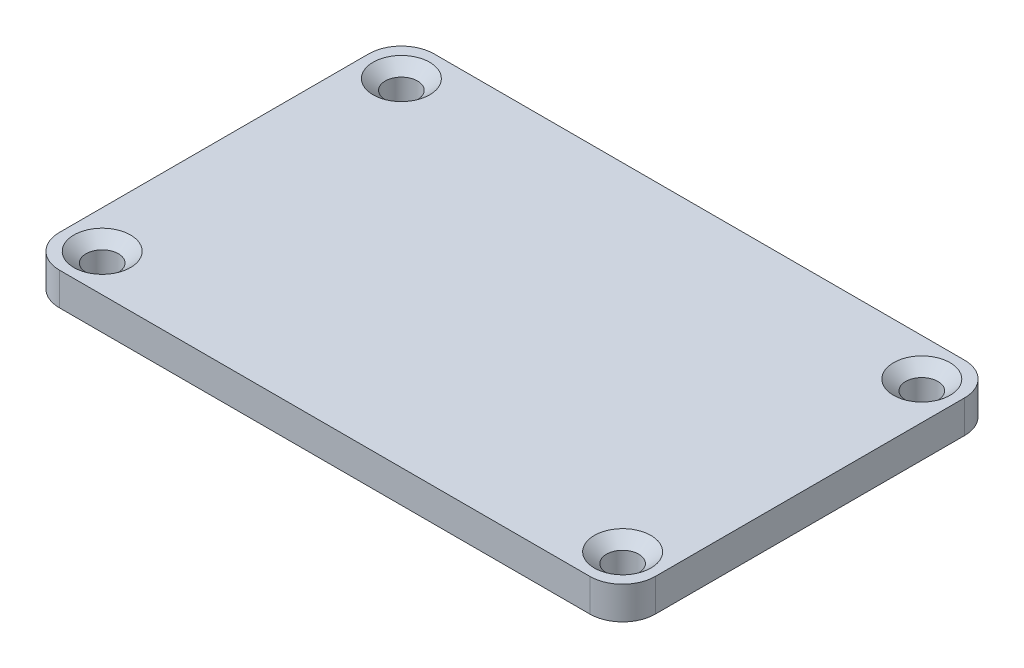
ISO-10303-21;
HEADER;
FILE_DESCRIPTION(('STEP AP214'),'2;1');
FILE_NAME('part.step','',(''),(''),'','','');
FILE_SCHEMA(('AUTOMOTIVE_DESIGN { 1 0 10303 214 1 1 1 1 }'));
ENDSEC;
DATA;
#1=APPLICATION_CONTEXT('core data for automotive mechanical design processes');
#2=APPLICATION_PROTOCOL_DEFINITION('international standard','automotive_design',2000,#1);
#3=PRODUCT_CONTEXT('',#1,'mechanical');
#4=PRODUCT('Part','Part','',(#3));
#5=PRODUCT_RELATED_PRODUCT_CATEGORY('part','',(#4));
#6=PRODUCT_DEFINITION_FORMATION('','',#4);
#7=PRODUCT_DEFINITION_CONTEXT('part definition',#1,'design');
#8=PRODUCT_DEFINITION('design','',#6,#7);
#9=PRODUCT_DEFINITION_SHAPE('','',#8);
#10=(LENGTH_UNIT() NAMED_UNIT(*) SI_UNIT(.MILLI.,.METRE.));
#11=(NAMED_UNIT(*) PLANE_ANGLE_UNIT() SI_UNIT($,.RADIAN.));
#12=(NAMED_UNIT(*) SI_UNIT($,.STERADIAN.) SOLID_ANGLE_UNIT());
#13=UNCERTAINTY_MEASURE_WITH_UNIT(LENGTH_MEASURE(1.E-05),#10,'distance_accuracy_value','');
#14=(GEOMETRIC_REPRESENTATION_CONTEXT(3) GLOBAL_UNCERTAINTY_ASSIGNED_CONTEXT((#13)) GLOBAL_UNIT_ASSIGNED_CONTEXT((#10,
#11,#12)) REPRESENTATION_CONTEXT('',''));
#15=CARTESIAN_POINT('',(0.,0.,0.));
#16=DIRECTION('',(0.,0.,1.));
#17=DIRECTION('',(1.,0.,0.));
#18=AXIS2_PLACEMENT_3D('',#15,#16,#17);
#19=CARTESIAN_POINT('',(30.099,3.302,18.923));
#20=DIRECTION('',(-1.,0.,0.));
#21=DIRECTION('',(0.,0.,1.));
#22=AXIS2_PLACEMENT_3D('',#19,#20,#21);
#23=PLANE('',#22);
#24=DIRECTION('',(0.,0.,-1.));
#25=VECTOR('',#24,1.);
#26=CARTESIAN_POINT('',(30.099,3.302,18.923));
#27=LINE('',#26,#25);
#28=CARTESIAN_POINT('',(30.099,3.302,15.621));
#29=VERTEX_POINT('',#28);
#30=CARTESIAN_POINT('',(30.099,3.302,-15.621));
#31=VERTEX_POINT('',#30);
#32=EDGE_CURVE('E118',#29,#31,#27,.T.);
#33=ORIENTED_EDGE('',*,*,#32,.F.);
#34=DIRECTION('',(0.,-1.,0.));
#35=VECTOR('',#34,1.);
#36=CARTESIAN_POINT('',(30.099,3.302,15.621));
#37=LINE('',#36,#35);
#38=CARTESIAN_POINT('',(30.099,0.,15.621));
#39=VERTEX_POINT('',#38);
#40=EDGE_CURVE('E103',#29,#39,#37,.T.);
#41=ORIENTED_EDGE('',*,*,#40,.T.);
#42=DIRECTION('',(0.,0.,-1.));
#43=VECTOR('',#42,1.);
#44=CARTESIAN_POINT('',(30.099,0.,18.923));
#45=LINE('',#44,#43);
#46=CARTESIAN_POINT('',(30.099,0.,-15.621));
#47=VERTEX_POINT('',#46);
#48=EDGE_CURVE('E115',#39,#47,#45,.T.);
#49=ORIENTED_EDGE('',*,*,#48,.T.);
#50=DIRECTION('',(0.,-1.,0.));
#51=VECTOR('',#50,1.);
#52=CARTESIAN_POINT('',(30.099,3.302,-15.621));
#53=LINE('',#52,#51);
#54=EDGE_CURVE('E120',#47,#31,#53,.F.);
#55=ORIENTED_EDGE('',*,*,#54,.T.);
#56=EDGE_LOOP('',(#33,#41,#49,#55));
#57=FACE_BOUND('',#56,.T.);
#58=ADVANCED_FACE('F33',(#57),#23,.F.);
#59=CARTESIAN_POINT('',(-30.099,3.302,-18.923));
#60=DIRECTION('',(0.,0.,1.));
#61=DIRECTION('',(1.,0.,0.));
#62=AXIS2_PLACEMENT_3D('',#59,#60,#61);
#63=PLANE('',#62);
#64=DIRECTION('',(-1.,0.,0.));
#65=VECTOR('',#64,1.);
#66=CARTESIAN_POINT('',(-30.099,3.302,-18.923));
#67=LINE('',#66,#65);
#68=CARTESIAN_POINT('',(26.797,3.302,-18.923));
#69=VERTEX_POINT('',#68);
#70=CARTESIAN_POINT('',(-26.797,3.302,-18.923));
#71=VERTEX_POINT('',#70);
#72=EDGE_CURVE('E164',#69,#71,#67,.T.);
#73=ORIENTED_EDGE('',*,*,#72,.F.);
#74=DIRECTION('',(0.,-1.,0.));
#75=VECTOR('',#74,1.);
#76=CARTESIAN_POINT('',(26.797,3.302,-18.923));
#77=LINE('',#76,#75);
#78=CARTESIAN_POINT('',(26.797,0.,-18.923));
#79=VERTEX_POINT('',#78);
#80=EDGE_CURVE('E157',#69,#79,#77,.T.);
#81=ORIENTED_EDGE('',*,*,#80,.T.);
#82=DIRECTION('',(-1.,0.,0.));
#83=VECTOR('',#82,1.);
#84=CARTESIAN_POINT('',(-30.099,0.,-18.923));
#85=LINE('',#84,#83);
#86=CARTESIAN_POINT('',(-26.797,0.,-18.923));
#87=VERTEX_POINT('',#86);
#88=EDGE_CURVE('E124',#79,#87,#85,.T.);
#89=ORIENTED_EDGE('',*,*,#88,.T.);
#90=DIRECTION('',(0.,-1.,0.));
#91=VECTOR('',#90,1.);
#92=CARTESIAN_POINT('',(-26.797,3.302,-18.923));
#93=LINE('',#92,#91);
#94=EDGE_CURVE('E155',#87,#71,#93,.F.);
#95=ORIENTED_EDGE('',*,*,#94,.T.);
#96=EDGE_LOOP('',(#73,#81,#89,#95));
#97=FACE_BOUND('',#96,.T.);
#98=ADVANCED_FACE('F162',(#97),#63,.F.);
#99=CARTESIAN_POINT('',(-30.099,3.302,18.923));
#100=DIRECTION('',(1.,0.,0.));
#101=DIRECTION('',(0.,0.,-1.));
#102=AXIS2_PLACEMENT_3D('',#99,#100,#101);
#103=PLANE('',#102);
#104=DIRECTION('',(0.,0.,1.));
#105=VECTOR('',#104,1.);
#106=CARTESIAN_POINT('',(-30.099,3.302,18.923));
#107=LINE('',#106,#105);
#108=CARTESIAN_POINT('',(-30.099,3.302,-15.621));
#109=VERTEX_POINT('',#108);
#110=CARTESIAN_POINT('',(-30.099,3.302,15.621));
#111=VERTEX_POINT('',#110);
#112=EDGE_CURVE('E172',#109,#111,#107,.T.);
#113=ORIENTED_EDGE('',*,*,#112,.F.);
#114=DIRECTION('',(0.,-1.,0.));
#115=VECTOR('',#114,1.);
#116=CARTESIAN_POINT('',(-30.099,3.302,-15.621));
#117=LINE('',#116,#115);
#118=CARTESIAN_POINT('',(-30.099,0.,-15.621));
#119=VERTEX_POINT('',#118);
#120=EDGE_CURVE('E11',#109,#119,#117,.T.);
#121=ORIENTED_EDGE('',*,*,#120,.T.);
#122=DIRECTION('',(0.,0.,1.));
#123=VECTOR('',#122,1.);
#124=CARTESIAN_POINT('',(-30.099,0.,18.923));
#125=LINE('',#124,#123);
#126=CARTESIAN_POINT('',(-30.099,0.,15.621));
#127=VERTEX_POINT('',#126);
#128=EDGE_CURVE('E128',#119,#127,#125,.T.);
#129=ORIENTED_EDGE('',*,*,#128,.T.);
#130=DIRECTION('',(0.,-1.,0.));
#131=VECTOR('',#130,1.);
#132=CARTESIAN_POINT('',(-30.099,3.302,15.621));
#133=LINE('',#132,#131);
#134=EDGE_CURVE('E41',#127,#111,#133,.F.);
#135=ORIENTED_EDGE('',*,*,#134,.T.);
#136=EDGE_LOOP('',(#113,#121,#129,#135));
#137=FACE_BOUND('',#136,.T.);
#138=ADVANCED_FACE('F171',(#137),#103,.F.);
#139=CARTESIAN_POINT('',(-30.099,3.302,18.923));
#140=DIRECTION('',(0.,0.,-1.));
#141=DIRECTION('',(-1.,0.,0.));
#142=AXIS2_PLACEMENT_3D('',#139,#140,#141);
#143=PLANE('',#142);
#144=DIRECTION('',(1.,0.,0.));
#145=VECTOR('',#144,1.);
#146=CARTESIAN_POINT('',(-30.099,0.,18.923));
#147=LINE('',#146,#145);
#148=CARTESIAN_POINT('',(-26.797,0.,18.923));
#149=VERTEX_POINT('',#148);
#150=CARTESIAN_POINT('',(26.797,0.,18.923));
#151=VERTEX_POINT('',#150);
#152=EDGE_CURVE('E138',#149,#151,#147,.T.);
#153=ORIENTED_EDGE('',*,*,#152,.T.);
#154=DIRECTION('',(0.,-1.,0.));
#155=VECTOR('',#154,1.);
#156=CARTESIAN_POINT('',(26.797,3.302,18.923));
#157=LINE('',#156,#155);
#158=CARTESIAN_POINT('',(26.797,3.302,18.923));
#159=VERTEX_POINT('',#158);
#160=EDGE_CURVE('E104',#151,#159,#157,.F.);
#161=ORIENTED_EDGE('',*,*,#160,.T.);
#162=DIRECTION('',(1.,0.,0.));
#163=VECTOR('',#162,1.);
#164=CARTESIAN_POINT('',(-30.099,3.302,18.923));
#165=LINE('',#164,#163);
#166=CARTESIAN_POINT('',(-26.797,3.302,18.923));
#167=VERTEX_POINT('',#166);
#168=EDGE_CURVE('E134',#167,#159,#165,.T.);
#169=ORIENTED_EDGE('',*,*,#168,.F.);
#170=DIRECTION('',(0.,-1.,0.));
#171=VECTOR('',#170,1.);
#172=CARTESIAN_POINT('',(-26.797,3.302,18.923));
#173=LINE('',#172,#171);
#174=EDGE_CURVE('E109',#167,#149,#173,.T.);
#175=ORIENTED_EDGE('',*,*,#174,.T.);
#176=EDGE_LOOP('',(#153,#161,#169,#175));
#177=FACE_BOUND('',#176,.T.);
#178=ADVANCED_FACE('F216',(#177),#143,.F.);
#179=CARTESIAN_POINT('',(0.,3.302,0.));
#180=DIRECTION('',(0.,-1.,0.));
#181=DIRECTION('',(0.,0.,-1.));
#182=AXIS2_PLACEMENT_3D('',#179,#180,#181);
#183=PLANE('',#182);
#184=CARTESIAN_POINT('',(-26.289,3.302,-15.113));
#185=DIRECTION('',(0.,1.,0.));
#186=DIRECTION('',(0.,0.,1.));
#187=AXIS2_PLACEMENT_3D('',#184,#185,#186);
#188=CIRCLE('',#187,2.8575);
#189=CARTESIAN_POINT('',(-26.289,3.302,-12.2555));
#190=VERTEX_POINT('',#189);
#191=EDGE_CURVE('E207',#190,#190,#188,.T.);
#192=ORIENTED_EDGE('',*,*,#191,.F.);
#193=EDGE_LOOP('',(#192));
#194=FACE_BOUND('',#193,.T.);
#195=CARTESIAN_POINT('',(-26.289,3.302,15.113));
#196=DIRECTION('',(0.,1.,0.));
#197=DIRECTION('',(0.,0.,1.));
#198=AXIS2_PLACEMENT_3D('',#195,#196,#197);
#199=CIRCLE('',#198,2.8575);
#200=CARTESIAN_POINT('',(-26.289,3.302,17.9705));
#201=VERTEX_POINT('',#200);
#202=EDGE_CURVE('E198',#201,#201,#199,.T.);
#203=ORIENTED_EDGE('',*,*,#202,.F.);
#204=EDGE_LOOP('',(#203));
#205=FACE_BOUND('',#204,.T.);
#206=CARTESIAN_POINT('',(26.289,3.302,15.113));
#207=DIRECTION('',(0.,1.,0.));
#208=DIRECTION('',(0.,0.,1.));
#209=AXIS2_PLACEMENT_3D('',#206,#207,#208);
#210=CIRCLE('',#209,2.8575);
#211=CARTESIAN_POINT('',(26.289,3.302,17.9705));
#212=VERTEX_POINT('',#211);
#213=EDGE_CURVE('E189',#212,#212,#210,.T.);
#214=ORIENTED_EDGE('',*,*,#213,.F.);
#215=EDGE_LOOP('',(#214));
#216=FACE_BOUND('',#215,.T.);
#217=CARTESIAN_POINT('',(26.289,3.302,-15.113));
#218=DIRECTION('',(0.,1.,0.));
#219=DIRECTION('',(0.,0.,1.));
#220=AXIS2_PLACEMENT_3D('',#217,#218,#219);
#221=CIRCLE('',#220,2.8575);
#222=CARTESIAN_POINT('',(26.289,3.302,-12.2555));
#223=VERTEX_POINT('',#222);
#224=EDGE_CURVE('E180',#223,#223,#221,.T.);
#225=ORIENTED_EDGE('',*,*,#224,.F.);
#226=EDGE_LOOP('',(#225));
#227=FACE_BOUND('',#226,.T.);
#228=ORIENTED_EDGE('',*,*,#168,.T.);
#229=CARTESIAN_POINT('',(26.797,3.302,15.621));
#230=DIRECTION('',(0.,-1.,0.));
#231=DIRECTION('',(0.,0.,-1.));
#232=AXIS2_PLACEMENT_3D('',#229,#230,#231);
#233=CIRCLE('',#232,3.302);
#234=EDGE_CURVE('E153',#159,#29,#233,.F.);
#235=ORIENTED_EDGE('',*,*,#234,.T.);
#236=ORIENTED_EDGE('',*,*,#32,.T.);
#237=CARTESIAN_POINT('',(26.797,3.302,-15.621));
#238=DIRECTION('',(0.,-1.,0.));
#239=DIRECTION('',(0.,0.,-1.));
#240=AXIS2_PLACEMENT_3D('',#237,#238,#239);
#241=CIRCLE('',#240,3.302);
#242=EDGE_CURVE('E151',#31,#69,#241,.F.);
#243=ORIENTED_EDGE('',*,*,#242,.T.);
#244=ORIENTED_EDGE('',*,*,#72,.T.);
#245=CARTESIAN_POINT('',(-26.797,3.302,-15.621));
#246=DIRECTION('',(0.,-1.,0.));
#247=DIRECTION('',(0.,0.,-1.));
#248=AXIS2_PLACEMENT_3D('',#245,#246,#247);
#249=CIRCLE('',#248,3.302);
#250=EDGE_CURVE('E54',#71,#109,#249,.F.);
#251=ORIENTED_EDGE('',*,*,#250,.T.);
#252=ORIENTED_EDGE('',*,*,#112,.T.);
#253=CARTESIAN_POINT('',(-26.797,3.302,15.621));
#254=DIRECTION('',(0.,-1.,0.));
#255=DIRECTION('',(0.,0.,-1.));
#256=AXIS2_PLACEMENT_3D('',#253,#254,#255);
#257=CIRCLE('',#256,3.302);
#258=EDGE_CURVE('E148',#111,#167,#257,.F.);
#259=ORIENTED_EDGE('',*,*,#258,.T.);
#260=EDGE_LOOP('',(#228,#235,#236,#243,#244,#251,#252,#259));
#261=FACE_BOUND('',#260,.T.);
#262=ADVANCED_FACE('F213',(#194,#205,#216,#227,#261),#183,.F.);
#263=CARTESIAN_POINT('',(0.,0.,0.));
#264=DIRECTION('',(0.,-1.,0.));
#265=DIRECTION('',(0.,0.,-1.));
#266=AXIS2_PLACEMENT_3D('',#263,#264,#265);
#267=PLANE('',#266);
#268=CARTESIAN_POINT('',(-26.289,0.,-15.113));
#269=DIRECTION('',(0.,1.,0.));
#270=DIRECTION('',(0.,0.,1.));
#271=AXIS2_PLACEMENT_3D('',#268,#269,#270);
#272=CIRCLE('',#271,1.63195);
#273=CARTESIAN_POINT('',(-26.289,0.,-13.48105));
#274=VERTEX_POINT('',#273);
#275=EDGE_CURVE('E201',#274,#274,#272,.T.);
#276=ORIENTED_EDGE('',*,*,#275,.T.);
#277=EDGE_LOOP('',(#276));
#278=FACE_BOUND('',#277,.T.);
#279=CARTESIAN_POINT('',(-26.289,0.,15.113));
#280=DIRECTION('',(0.,1.,0.));
#281=DIRECTION('',(0.,0.,1.));
#282=AXIS2_PLACEMENT_3D('',#279,#280,#281);
#283=CIRCLE('',#282,1.63195);
#284=CARTESIAN_POINT('',(-26.289,0.,16.74495));
#285=VERTEX_POINT('',#284);
#286=EDGE_CURVE('E192',#285,#285,#283,.T.);
#287=ORIENTED_EDGE('',*,*,#286,.T.);
#288=EDGE_LOOP('',(#287));
#289=FACE_BOUND('',#288,.T.);
#290=CARTESIAN_POINT('',(26.289,0.,15.113));
#291=DIRECTION('',(0.,1.,0.));
#292=DIRECTION('',(0.,0.,1.));
#293=AXIS2_PLACEMENT_3D('',#290,#291,#292);
#294=CIRCLE('',#293,1.63195);
#295=CARTESIAN_POINT('',(26.289,0.,16.74495));
#296=VERTEX_POINT('',#295);
#297=EDGE_CURVE('E183',#296,#296,#294,.T.);
#298=ORIENTED_EDGE('',*,*,#297,.T.);
#299=EDGE_LOOP('',(#298));
#300=FACE_BOUND('',#299,.T.);
#301=CARTESIAN_POINT('',(26.289,0.,-15.113));
#302=DIRECTION('',(0.,1.,0.));
#303=DIRECTION('',(0.,0.,1.));
#304=AXIS2_PLACEMENT_3D('',#301,#302,#303);
#305=CIRCLE('',#304,1.63195);
#306=CARTESIAN_POINT('',(26.289,0.,-13.48105));
#307=VERTEX_POINT('',#306);
#308=EDGE_CURVE('E125',#307,#307,#305,.T.);
#309=ORIENTED_EDGE('',*,*,#308,.T.);
#310=EDGE_LOOP('',(#309));
#311=FACE_BOUND('',#310,.T.);
#312=ORIENTED_EDGE('',*,*,#48,.F.);
#313=CARTESIAN_POINT('',(26.797,0.,15.621));
#314=DIRECTION('',(0.,-1.,0.));
#315=DIRECTION('',(0.,0.,-1.));
#316=AXIS2_PLACEMENT_3D('',#313,#314,#315);
#317=CIRCLE('',#316,3.302);
#318=EDGE_CURVE('E99',#39,#151,#317,.T.);
#319=ORIENTED_EDGE('',*,*,#318,.T.);
#320=ORIENTED_EDGE('',*,*,#152,.F.);
#321=CARTESIAN_POINT('',(-26.797,0.,15.621));
#322=DIRECTION('',(0.,-1.,0.));
#323=DIRECTION('',(0.,0.,-1.));
#324=AXIS2_PLACEMENT_3D('',#321,#322,#323);
#325=CIRCLE('',#324,3.302);
#326=EDGE_CURVE('E119',#149,#127,#325,.T.);
#327=ORIENTED_EDGE('',*,*,#326,.T.);
#328=ORIENTED_EDGE('',*,*,#128,.F.);
#329=CARTESIAN_POINT('',(-26.797,0.,-15.621));
#330=DIRECTION('',(0.,-1.,0.));
#331=DIRECTION('',(0.,0.,-1.));
#332=AXIS2_PLACEMENT_3D('',#329,#330,#331);
#333=CIRCLE('',#332,3.302);
#334=EDGE_CURVE('E142',#119,#87,#333,.T.);
#335=ORIENTED_EDGE('',*,*,#334,.T.);
#336=ORIENTED_EDGE('',*,*,#88,.F.);
#337=CARTESIAN_POINT('',(26.797,0.,-15.621));
#338=DIRECTION('',(0.,-1.,0.));
#339=DIRECTION('',(0.,0.,-1.));
#340=AXIS2_PLACEMENT_3D('',#337,#338,#339);
#341=CIRCLE('',#340,3.302);
#342=EDGE_CURVE('E110',#79,#47,#341,.T.);
#343=ORIENTED_EDGE('',*,*,#342,.T.);
#344=EDGE_LOOP('',(#312,#319,#320,#327,#328,#335,#336,#343));
#345=FACE_BOUND('',#344,.T.);
#346=ADVANCED_FACE('F122',(#278,#289,#300,#311,#345),#267,.T.);
#347=CARTESIAN_POINT('',(26.797,3.302,15.621));
#348=DIRECTION('',(0.,-1.,0.));
#349=DIRECTION('',(0.,0.,-1.));
#350=AXIS2_PLACEMENT_3D('',#347,#348,#349);
#351=CYLINDRICAL_SURFACE('',#350,3.302);
#352=ORIENTED_EDGE('',*,*,#234,.F.);
#353=ORIENTED_EDGE('',*,*,#160,.F.);
#354=ORIENTED_EDGE('',*,*,#318,.F.);
#355=ORIENTED_EDGE('',*,*,#40,.F.);
#356=EDGE_LOOP('',(#352,#353,#354,#355));
#357=FACE_BOUND('',#356,.T.);
#358=ADVANCED_FACE('F102',(#357),#351,.T.);
#359=CARTESIAN_POINT('',(26.797,3.302,-15.621));
#360=DIRECTION('',(0.,-1.,0.));
#361=DIRECTION('',(0.,0.,-1.));
#362=AXIS2_PLACEMENT_3D('',#359,#360,#361);
#363=CYLINDRICAL_SURFACE('',#362,3.302);
#364=ORIENTED_EDGE('',*,*,#242,.F.);
#365=ORIENTED_EDGE('',*,*,#54,.F.);
#366=ORIENTED_EDGE('',*,*,#342,.F.);
#367=ORIENTED_EDGE('',*,*,#80,.F.);
#368=EDGE_LOOP('',(#364,#365,#366,#367));
#369=FACE_BOUND('',#368,.T.);
#370=ADVANCED_FACE('F236',(#369),#363,.T.);
#371=CARTESIAN_POINT('',(-26.797,3.302,-15.621));
#372=DIRECTION('',(0.,-1.,0.));
#373=DIRECTION('',(0.,0.,-1.));
#374=AXIS2_PLACEMENT_3D('',#371,#372,#373);
#375=CYLINDRICAL_SURFACE('',#374,3.302);
#376=ORIENTED_EDGE('',*,*,#250,.F.);
#377=ORIENTED_EDGE('',*,*,#94,.F.);
#378=ORIENTED_EDGE('',*,*,#334,.F.);
#379=ORIENTED_EDGE('',*,*,#120,.F.);
#380=EDGE_LOOP('',(#376,#377,#378,#379));
#381=FACE_BOUND('',#380,.T.);
#382=ADVANCED_FACE('F170',(#381),#375,.T.);
#383=CARTESIAN_POINT('',(-26.797,3.302,15.621));
#384=DIRECTION('',(0.,-1.,0.));
#385=DIRECTION('',(0.,0.,-1.));
#386=AXIS2_PLACEMENT_3D('',#383,#384,#385);
#387=CYLINDRICAL_SURFACE('',#386,3.302);
#388=ORIENTED_EDGE('',*,*,#258,.F.);
#389=ORIENTED_EDGE('',*,*,#134,.F.);
#390=ORIENTED_EDGE('',*,*,#326,.F.);
#391=ORIENTED_EDGE('',*,*,#174,.F.);
#392=EDGE_LOOP('',(#388,#389,#390,#391));
#393=FACE_BOUND('',#392,.T.);
#394=ADVANCED_FACE('F35',(#393),#387,.T.);
#395=CARTESIAN_POINT('',(26.289,3.302,-15.113));
#396=DIRECTION('',(0.,1.,0.));
#397=DIRECTION('',(0.,0.,1.));
#398=AXIS2_PLACEMENT_3D('',#395,#396,#397);
#399=CYLINDRICAL_SURFACE('',#398,1.63195);
#400=ORIENTED_EDGE('',*,*,#308,.F.);
#401=EDGE_LOOP('',(#400));
#402=FACE_BOUND('',#401,.T.);
#403=CARTESIAN_POINT('',(26.289,2.27364144701068,-15.113));
#404=DIRECTION('',(0.,1.,0.));
#405=DIRECTION('',(0.,0.,1.));
#406=AXIS2_PLACEMENT_3D('',#403,#404,#405);
#407=CIRCLE('',#406,1.63195);
#408=CARTESIAN_POINT('',(26.289,2.27364144701068,-13.48105));
#409=VERTEX_POINT('',#408);
#410=EDGE_CURVE('E131',#409,#409,#407,.T.);
#411=ORIENTED_EDGE('',*,*,#410,.T.);
#412=EDGE_LOOP('',(#411));
#413=FACE_BOUND('',#412,.T.);
#414=ADVANCED_FACE('F228',(#402,#413),#399,.F.);
#415=CARTESIAN_POINT('',(26.289,3.302,-15.113));
#416=DIRECTION('',(0.,1.,0.));
#417=DIRECTION('',(0.,0.,1.));
#418=AXIS2_PLACEMENT_3D('',#415,#416,#417);
#419=CONICAL_SURFACE('',#418,2.8575,0.872664625997163);
#420=ORIENTED_EDGE('',*,*,#410,.F.);
#421=EDGE_LOOP('',(#420));
#422=FACE_BOUND('',#421,.T.);
#423=ORIENTED_EDGE('',*,*,#224,.T.);
#424=EDGE_LOOP('',(#423));
#425=FACE_BOUND('',#424,.T.);
#426=ADVANCED_FACE('F233',(#422,#425),#419,.F.);
#427=CARTESIAN_POINT('',(26.289,3.302,15.113));
#428=DIRECTION('',(0.,1.,0.));
#429=DIRECTION('',(0.,0.,1.));
#430=AXIS2_PLACEMENT_3D('',#427,#428,#429);
#431=CYLINDRICAL_SURFACE('',#430,1.63195);
#432=ORIENTED_EDGE('',*,*,#297,.F.);
#433=EDGE_LOOP('',(#432));
#434=FACE_BOUND('',#433,.T.);
#435=CARTESIAN_POINT('',(26.289,2.27364144701068,15.113));
#436=DIRECTION('',(0.,1.,0.));
#437=DIRECTION('',(0.,0.,1.));
#438=AXIS2_PLACEMENT_3D('',#435,#436,#437);
#439=CIRCLE('',#438,1.63195);
#440=CARTESIAN_POINT('',(26.289,2.27364144701068,16.74495));
#441=VERTEX_POINT('',#440);
#442=EDGE_CURVE('E186',#441,#441,#439,.T.);
#443=ORIENTED_EDGE('',*,*,#442,.T.);
#444=EDGE_LOOP('',(#443));
#445=FACE_BOUND('',#444,.T.);
#446=ADVANCED_FACE('F293',(#434,#445),#431,.F.);
#447=CARTESIAN_POINT('',(26.289,3.302,15.113));
#448=DIRECTION('',(0.,1.,0.));
#449=DIRECTION('',(0.,0.,1.));
#450=AXIS2_PLACEMENT_3D('',#447,#448,#449);
#451=CONICAL_SURFACE('',#450,2.8575,0.872664625997163);
#452=ORIENTED_EDGE('',*,*,#442,.F.);
#453=EDGE_LOOP('',(#452));
#454=FACE_BOUND('',#453,.T.);
#455=ORIENTED_EDGE('',*,*,#213,.T.);
#456=EDGE_LOOP('',(#455));
#457=FACE_BOUND('',#456,.T.);
#458=ADVANCED_FACE('F303',(#454,#457),#451,.F.);
#459=CARTESIAN_POINT('',(-26.289,3.302,15.113));
#460=DIRECTION('',(0.,1.,0.));
#461=DIRECTION('',(0.,0.,1.));
#462=AXIS2_PLACEMENT_3D('',#459,#460,#461);
#463=CYLINDRICAL_SURFACE('',#462,1.63195);
#464=ORIENTED_EDGE('',*,*,#286,.F.);
#465=EDGE_LOOP('',(#464));
#466=FACE_BOUND('',#465,.T.);
#467=CARTESIAN_POINT('',(-26.289,2.27364144701068,15.113));
#468=DIRECTION('',(0.,1.,0.));
#469=DIRECTION('',(0.,0.,1.));
#470=AXIS2_PLACEMENT_3D('',#467,#468,#469);
#471=CIRCLE('',#470,1.63195);
#472=CARTESIAN_POINT('',(-26.289,2.27364144701068,16.74495));
#473=VERTEX_POINT('',#472);
#474=EDGE_CURVE('E195',#473,#473,#471,.T.);
#475=ORIENTED_EDGE('',*,*,#474,.T.);
#476=EDGE_LOOP('',(#475));
#477=FACE_BOUND('',#476,.T.);
#478=ADVANCED_FACE('F313',(#466,#477),#463,.F.);
#479=CARTESIAN_POINT('',(-26.289,3.302,15.113));
#480=DIRECTION('',(0.,1.,0.));
#481=DIRECTION('',(0.,0.,1.));
#482=AXIS2_PLACEMENT_3D('',#479,#480,#481);
#483=CONICAL_SURFACE('',#482,2.8575,0.872664625997163);
#484=ORIENTED_EDGE('',*,*,#474,.F.);
#485=EDGE_LOOP('',(#484));
#486=FACE_BOUND('',#485,.T.);
#487=ORIENTED_EDGE('',*,*,#202,.T.);
#488=EDGE_LOOP('',(#487));
#489=FACE_BOUND('',#488,.T.);
#490=ADVANCED_FACE('F323',(#486,#489),#483,.F.);
#491=CARTESIAN_POINT('',(-26.289,3.302,-15.113));
#492=DIRECTION('',(0.,1.,0.));
#493=DIRECTION('',(0.,0.,1.));
#494=AXIS2_PLACEMENT_3D('',#491,#492,#493);
#495=CYLINDRICAL_SURFACE('',#494,1.63195);
#496=ORIENTED_EDGE('',*,*,#275,.F.);
#497=EDGE_LOOP('',(#496));
#498=FACE_BOUND('',#497,.T.);
#499=CARTESIAN_POINT('',(-26.289,2.27364144701068,-15.113));
#500=DIRECTION('',(0.,1.,0.));
#501=DIRECTION('',(0.,0.,1.));
#502=AXIS2_PLACEMENT_3D('',#499,#500,#501);
#503=CIRCLE('',#502,1.63195);
#504=CARTESIAN_POINT('',(-26.289,2.27364144701068,-13.48105));
#505=VERTEX_POINT('',#504);
#506=EDGE_CURVE('E204',#505,#505,#503,.T.);
#507=ORIENTED_EDGE('',*,*,#506,.T.);
#508=EDGE_LOOP('',(#507));
#509=FACE_BOUND('',#508,.T.);
#510=ADVANCED_FACE('F333',(#498,#509),#495,.F.);
#511=CARTESIAN_POINT('',(-26.289,3.302,-15.113));
#512=DIRECTION('',(0.,1.,0.));
#513=DIRECTION('',(0.,0.,1.));
#514=AXIS2_PLACEMENT_3D('',#511,#512,#513);
#515=CONICAL_SURFACE('',#514,2.8575,0.872664625997163);
#516=ORIENTED_EDGE('',*,*,#506,.F.);
#517=EDGE_LOOP('',(#516));
#518=FACE_BOUND('',#517,.T.);
#519=ORIENTED_EDGE('',*,*,#191,.T.);
#520=EDGE_LOOP('',(#519));
#521=FACE_BOUND('',#520,.T.);
#522=ADVANCED_FACE('F211',(#518,#521),#515,.F.);
#523=CLOSED_SHELL('',(#58,#98,#138,#178,#262,#346,#358,#370,#382,#394,#414,#426,#446,#458,#478,
#490,#510,#522));
#524=MANIFOLD_SOLID_BREP('B2',#523);
#525=ADVANCED_BREP_SHAPE_REPRESENTATION('',(#18,#524),#14);
#526=SHAPE_DEFINITION_REPRESENTATION(#9,#525);
ENDSEC;
END-ISO-10303-21;
